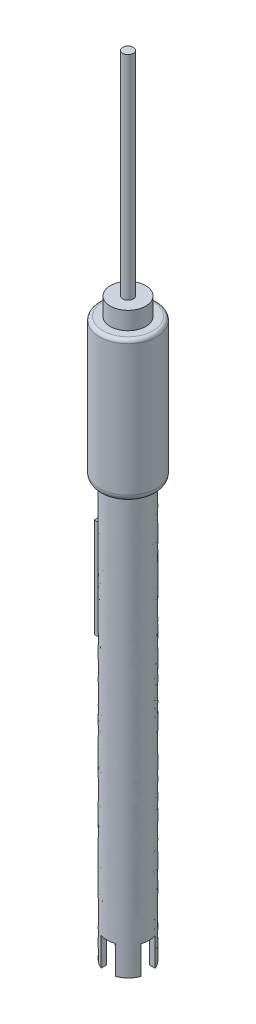
ISO-10303-21;
HEADER;
FILE_DESCRIPTION(('STEP AP214'),'2;1');
FILE_NAME('part.step','',(''),(''),'','','');
FILE_SCHEMA(('AUTOMOTIVE_DESIGN { 1 0 10303 214 1 1 1 1 }'));
ENDSEC;
DATA;
#1=APPLICATION_CONTEXT('core data for automotive mechanical design processes');
#2=APPLICATION_PROTOCOL_DEFINITION('international standard','automotive_design',2000,#1);
#3=PRODUCT_CONTEXT('',#1,'mechanical');
#4=PRODUCT('Part','Part','',(#3));
#5=PRODUCT_RELATED_PRODUCT_CATEGORY('part','',(#4));
#6=PRODUCT_DEFINITION_FORMATION('','',#4);
#7=PRODUCT_DEFINITION_CONTEXT('part definition',#1,'design');
#8=PRODUCT_DEFINITION('design','',#6,#7);
#9=PRODUCT_DEFINITION_SHAPE('','',#8);
#10=(LENGTH_UNIT() NAMED_UNIT(*) SI_UNIT(.MILLI.,.METRE.));
#11=(NAMED_UNIT(*) PLANE_ANGLE_UNIT() SI_UNIT($,.RADIAN.));
#12=(NAMED_UNIT(*) SI_UNIT($,.STERADIAN.) SOLID_ANGLE_UNIT());
#13=UNCERTAINTY_MEASURE_WITH_UNIT(LENGTH_MEASURE(1.E-05),#10,'distance_accuracy_value','');
#14=(GEOMETRIC_REPRESENTATION_CONTEXT(3) GLOBAL_UNCERTAINTY_ASSIGNED_CONTEXT((#13)) GLOBAL_UNIT_ASSIGNED_CONTEXT((#10,
#11,#12)) REPRESENTATION_CONTEXT('',''));
#15=CARTESIAN_POINT('',(0.,0.,0.));
#16=DIRECTION('',(0.,0.,1.));
#17=DIRECTION('',(1.,0.,0.));
#18=AXIS2_PLACEMENT_3D('',#15,#16,#17);
#19=CARTESIAN_POINT('',(0.,117.5,0.));
#20=DIRECTION('',(0.,-1.,0.));
#21=DIRECTION('',(-1.,0.,0.));
#22=AXIS2_PLACEMENT_3D('',#19,#20,#21);
#23=ELLIPSE('',#22,6.,5.9);
#24=DIRECTION('',(0.,-1.,0.));
#25=VECTOR('',#24,1.);
#26=SURFACE_OF_LINEAR_EXTRUSION('',#23,#25);
#27=DIRECTION('',(0.,-1.,0.));
#28=VECTOR('',#27,1.);
#29=CARTESIAN_POINT('',(5.64475488259441,117.5,2.));
#30=LINE('',#29,#28);
#31=CARTESIAN_POINT('',(5.64475488259441,8.,2.));
#32=VERTEX_POINT('',#31);
#33=CARTESIAN_POINT('',(5.64475488259441,0.,2.));
#34=VERTEX_POINT('',#33);
#35=EDGE_CURVE('E264',#32,#34,#30,.T.);
#36=ORIENTED_EDGE('',*,*,#35,.F.);
#37=CARTESIAN_POINT('',(0.,8.00000000000004,0.));
#38=DIRECTION('',(0.,-1.,0.));
#39=DIRECTION('',(-1.,0.,0.));
#40=AXIS2_PLACEMENT_3D('',#37,#38,#39);
#41=ELLIPSE('',#40,6.,5.9);
#42=CARTESIAN_POINT('',(5.64475488259441,8.,-2.));
#43=VERTEX_POINT('',#42);
#44=EDGE_CURVE('E70',#32,#43,#41,.F.);
#45=ORIENTED_EDGE('',*,*,#44,.T.);
#46=DIRECTION('',(0.,-1.,0.));
#47=VECTOR('',#46,1.);
#48=CARTESIAN_POINT('',(5.64475488259441,117.5,-2.));
#49=LINE('',#48,#47);
#50=CARTESIAN_POINT('',(5.64475488259441,0.,-2.));
#51=VERTEX_POINT('',#50);
#52=EDGE_CURVE('E261',#43,#51,#49,.T.);
#53=ORIENTED_EDGE('',*,*,#52,.T.);
#54=CARTESIAN_POINT('',(0.,0.,0.));
#55=DIRECTION('',(0.,-1.,0.));
#56=DIRECTION('',(-1.,0.,0.));
#57=AXIS2_PLACEMENT_3D('',#54,#55,#56);
#58=ELLIPSE('',#57,6.,5.9);
#59=CARTESIAN_POINT('',(2.,0.,-5.56257334533417));
#60=VERTEX_POINT('',#59);
#61=EDGE_CURVE('E412',#60,#51,#58,.T.);
#62=ORIENTED_EDGE('',*,*,#61,.F.);
#63=DIRECTION('',(0.,-1.,0.));
#64=VECTOR('',#63,1.);
#65=CARTESIAN_POINT('',(2.,117.5,-5.56257334533418));
#66=LINE('',#65,#64);
#67=CARTESIAN_POINT('',(2.,8.,-5.56257334533417));
#68=VERTEX_POINT('',#67);
#69=EDGE_CURVE('E222',#60,#68,#66,.F.);
#70=ORIENTED_EDGE('',*,*,#69,.T.);
#71=CARTESIAN_POINT('',(-2.,8.,-5.56257334533417));
#72=VERTEX_POINT('',#71);
#73=EDGE_CURVE('E386',#68,#72,#41,.F.);
#74=ORIENTED_EDGE('',*,*,#73,.T.);
#75=DIRECTION('',(0.,-1.,0.));
#76=VECTOR('',#75,1.);
#77=CARTESIAN_POINT('',(-2.,117.5,-5.56257334533418));
#78=LINE('',#77,#76);
#79=CARTESIAN_POINT('',(-2.,0.,-5.56257334533417));
#80=VERTEX_POINT('',#79);
#81=EDGE_CURVE('E251',#80,#72,#78,.F.);
#82=ORIENTED_EDGE('',*,*,#81,.F.);
#83=CARTESIAN_POINT('',(-5.64475488259441,0.,-2.));
#84=VERTEX_POINT('',#83);
#85=EDGE_CURVE('E297',#84,#80,#58,.T.);
#86=ORIENTED_EDGE('',*,*,#85,.F.);
#87=DIRECTION('',(0.,-1.,0.));
#88=VECTOR('',#87,1.);
#89=CARTESIAN_POINT('',(-5.64475488259441,117.5,-2.));
#90=LINE('',#89,#88);
#91=CARTESIAN_POINT('',(-5.64475488259441,8.,-2.));
#92=VERTEX_POINT('',#91);
#93=EDGE_CURVE('E255',#84,#92,#90,.F.);
#94=ORIENTED_EDGE('',*,*,#93,.T.);
#95=CARTESIAN_POINT('',(-5.64475488259441,8.,2.));
#96=VERTEX_POINT('',#95);
#97=EDGE_CURVE('E389',#92,#96,#41,.F.);
#98=ORIENTED_EDGE('',*,*,#97,.T.);
#99=DIRECTION('',(0.,-1.,0.));
#100=VECTOR('',#99,1.);
#101=CARTESIAN_POINT('',(-5.64475488259441,117.5,2.));
#102=LINE('',#101,#100);
#103=CARTESIAN_POINT('',(-5.64475488259441,0.,2.));
#104=VERTEX_POINT('',#103);
#105=EDGE_CURVE('E258',#104,#96,#102,.F.);
#106=ORIENTED_EDGE('',*,*,#105,.F.);
#107=CARTESIAN_POINT('',(-2.,0.,5.56257334533418));
#108=VERTEX_POINT('',#107);
#109=EDGE_CURVE('E283',#108,#104,#58,.T.);
#110=ORIENTED_EDGE('',*,*,#109,.F.);
#111=DIRECTION('',(0.,-1.,0.));
#112=VECTOR('',#111,1.);
#113=CARTESIAN_POINT('',(-2.,117.5,5.56257334533418));
#114=LINE('',#113,#112);
#115=CARTESIAN_POINT('',(-2.,8.,5.56257334533418));
#116=VERTEX_POINT('',#115);
#117=EDGE_CURVE('E248',#116,#108,#114,.T.);
#118=ORIENTED_EDGE('',*,*,#117,.F.);
#119=CARTESIAN_POINT('',(2.,8.,5.56257334533418));
#120=VERTEX_POINT('',#119);
#121=EDGE_CURVE('E384',#116,#120,#41,.F.);
#122=ORIENTED_EDGE('',*,*,#121,.T.);
#123=DIRECTION('',(0.,-1.,0.));
#124=VECTOR('',#123,1.);
#125=CARTESIAN_POINT('',(2.,117.5,5.56257334533418));
#126=LINE('',#125,#124);
#127=CARTESIAN_POINT('',(2.,0.,5.56257334533418));
#128=VERTEX_POINT('',#127);
#129=EDGE_CURVE('E240',#120,#128,#126,.T.);
#130=ORIENTED_EDGE('',*,*,#129,.T.);
#131=EDGE_CURVE('E410',#34,#128,#58,.T.);
#132=ORIENTED_EDGE('',*,*,#131,.F.);
#133=EDGE_LOOP('',(#36,#45,#53,#62,#70,#74,#82,#86,#94,#98,#106,#110,#118,#122,#130,#132));
#134=FACE_BOUND('',#133,.T.);
#135=DIRECTION('',(0.,-1.,0.));
#136=VECTOR('',#135,1.);
#137=CARTESIAN_POINT('',(-5.16646201866328,117.5,2.99999999999999));
#138=LINE('',#137,#136);
#139=CARTESIAN_POINT('',(-5.16646201866328,78.,2.99999999999999));
#140=VERTEX_POINT('',#139);
#141=CARTESIAN_POINT('',(-5.16646201866328,106.,2.99999999999999));
#142=VERTEX_POINT('',#141);
#143=EDGE_CURVE('E375',#140,#142,#138,.F.);
#144=ORIENTED_EDGE('',*,*,#143,.F.);
#145=CARTESIAN_POINT('',(0.,78.,0.));
#146=DIRECTION('',(0.,-1.,0.));
#147=DIRECTION('',(-1.,0.,0.));
#148=AXIS2_PLACEMENT_3D('',#145,#146,#147);
#149=ELLIPSE('',#148,6.,5.9);
#150=CARTESIAN_POINT('',(-5.16646201866326,78.,-3.00000000000001));
#151=VERTEX_POINT('',#150);
#152=EDGE_CURVE('E366',#151,#140,#149,.F.);
#153=ORIENTED_EDGE('',*,*,#152,.F.);
#154=DIRECTION('',(0.,-1.,0.));
#155=VECTOR('',#154,1.);
#156=CARTESIAN_POINT('',(-5.16646201866326,117.5,-3.00000000000001));
#157=LINE('',#156,#155);
#158=CARTESIAN_POINT('',(-5.16646201866326,106.,-3.00000000000001));
#159=VERTEX_POINT('',#158);
#160=EDGE_CURVE('E369',#159,#151,#157,.T.);
#161=ORIENTED_EDGE('',*,*,#160,.F.);
#162=CARTESIAN_POINT('',(0.,106.,0.));
#163=DIRECTION('',(0.,-1.,0.));
#164=DIRECTION('',(-1.,0.,0.));
#165=AXIS2_PLACEMENT_3D('',#162,#163,#164);
#166=ELLIPSE('',#165,6.,5.9);
#167=EDGE_CURVE('E372',#142,#159,#166,.T.);
#168=ORIENTED_EDGE('',*,*,#167,.F.);
#169=EDGE_LOOP('',(#144,#153,#161,#168));
#170=FACE_BOUND('',#169,.T.);
#171=CARTESIAN_POINT('',(-6.,117.5,0.));
#172=VERTEX_POINT('',#171);
#173=EDGE_CURVE('E292',#172,#172,#23,.T.);
#174=ORIENTED_EDGE('',*,*,#173,.T.);
#175=EDGE_LOOP('',(#174));
#176=FACE_BOUND('',#175,.T.);
#177=ADVANCED_FACE('F62',(#134,#170,#176),#26,.T.);
#178=CARTESIAN_POINT('',(0.,0.,0.));
#179=DIRECTION('',(0.,1.,0.));
#180=DIRECTION('',(0.,0.,1.));
#181=AXIS2_PLACEMENT_3D('',#178,#179,#180);
#182=PLANE('',#181);
#183=DIRECTION('',(1.,0.,0.));
#184=VECTOR('',#183,1.);
#185=CARTESIAN_POINT('',(0.,0.,-2.));
#186=LINE('',#185,#184);
#187=CARTESIAN_POINT('',(4.03112887414927,0.,-2.));
#188=VERTEX_POINT('',#187);
#189=EDGE_CURVE('E216',#188,#51,#186,.T.);
#190=ORIENTED_EDGE('',*,*,#189,.F.);
#191=CARTESIAN_POINT('',(0.,0.,0.));
#192=DIRECTION('',(0.,-1.,0.));
#193=DIRECTION('',(0.,0.,-1.));
#194=AXIS2_PLACEMENT_3D('',#191,#192,#193);
#195=CIRCLE('',#194,4.5);
#196=CARTESIAN_POINT('',(2.,0.,-4.03112887414927));
#197=VERTEX_POINT('',#196);
#198=EDGE_CURVE('E200',#197,#188,#195,.T.);
#199=ORIENTED_EDGE('',*,*,#198,.F.);
#200=DIRECTION('',(0.,0.,1.));
#201=VECTOR('',#200,1.);
#202=CARTESIAN_POINT('',(2.,0.,5.9));
#203=LINE('',#202,#201);
#204=EDGE_CURVE('E214',#197,#60,#203,.F.);
#205=ORIENTED_EDGE('',*,*,#204,.T.);
#206=ORIENTED_EDGE('',*,*,#61,.T.);
#207=EDGE_LOOP('',(#190,#199,#205,#206));
#208=FACE_BOUND('',#207,.T.);
#209=ADVANCED_FACE('F212',(#208),#182,.F.);
#210=DIRECTION('',(0.,0.,1.));
#211=VECTOR('',#210,1.);
#212=CARTESIAN_POINT('',(-2.,0.,5.9));
#213=LINE('',#212,#211);
#214=CARTESIAN_POINT('',(-2.,0.,-4.03112887414927));
#215=VERTEX_POINT('',#214);
#216=EDGE_CURVE('E225',#215,#80,#213,.F.);
#217=ORIENTED_EDGE('',*,*,#216,.F.);
#218=CARTESIAN_POINT('',(-4.03112887414927,0.,-2.));
#219=VERTEX_POINT('',#218);
#220=EDGE_CURVE('E219',#219,#215,#195,.T.);
#221=ORIENTED_EDGE('',*,*,#220,.F.);
#222=DIRECTION('',(1.,0.,0.));
#223=VECTOR('',#222,1.);
#224=CARTESIAN_POINT('',(6.,0.,-2.));
#225=LINE('',#224,#223);
#226=EDGE_CURVE('E243',#219,#84,#225,.F.);
#227=ORIENTED_EDGE('',*,*,#226,.T.);
#228=ORIENTED_EDGE('',*,*,#85,.T.);
#229=EDGE_LOOP('',(#217,#221,#227,#228));
#230=FACE_BOUND('',#229,.T.);
#231=ADVANCED_FACE('F460',(#230),#182,.F.);
#232=DIRECTION('',(1.,0.,0.));
#233=VECTOR('',#232,1.);
#234=CARTESIAN_POINT('',(6.,0.,2.));
#235=LINE('',#234,#233);
#236=CARTESIAN_POINT('',(-4.03112887414927,0.,2.));
#237=VERTEX_POINT('',#236);
#238=EDGE_CURVE('E241',#237,#104,#235,.F.);
#239=ORIENTED_EDGE('',*,*,#238,.F.);
#240=CARTESIAN_POINT('',(-2.,0.,4.03112887414927));
#241=VERTEX_POINT('',#240);
#242=EDGE_CURVE('E408',#241,#237,#195,.T.);
#243=ORIENTED_EDGE('',*,*,#242,.F.);
#244=DIRECTION('',(0.,0.,1.));
#245=VECTOR('',#244,1.);
#246=CARTESIAN_POINT('',(-2.,0.,0.));
#247=LINE('',#246,#245);
#248=EDGE_CURVE('E382',#241,#108,#247,.T.);
#249=ORIENTED_EDGE('',*,*,#248,.T.);
#250=ORIENTED_EDGE('',*,*,#109,.T.);
#251=EDGE_LOOP('',(#239,#243,#249,#250));
#252=FACE_BOUND('',#251,.T.);
#253=ADVANCED_FACE('F335',(#252),#182,.F.);
#254=CARTESIAN_POINT('',(0.,0.,0.));
#255=DIRECTION('',(0.,1.,0.));
#256=DIRECTION('',(0.,0.,1.));
#257=AXIS2_PLACEMENT_3D('',#254,#255,#256);
#258=CYLINDRICAL_SURFACE('',#257,8.07499999999998);
#259=CARTESIAN_POINT('',(0.,156.5,0.));
#260=DIRECTION('',(0.,-1.,0.));
#261=DIRECTION('',(0.,0.,-1.));
#262=AXIS2_PLACEMENT_3D('',#259,#260,#261);
#263=CIRCLE('',#262,8.07499999999998);
#264=CARTESIAN_POINT('',(0.,156.5,-8.07499999999998));
#265=VERTEX_POINT('',#264);
#266=EDGE_CURVE('E362',#265,#265,#263,.T.);
#267=ORIENTED_EDGE('',*,*,#266,.T.);
#268=EDGE_LOOP('',(#267));
#269=FACE_BOUND('',#268,.T.);
#270=CARTESIAN_POINT('',(0.,119.49232903909,0.));
#271=DIRECTION('',(0.,-1.,0.));
#272=DIRECTION('',(0.,0.,-1.));
#273=AXIS2_PLACEMENT_3D('',#270,#271,#272);
#274=CIRCLE('',#273,8.07499999999998);
#275=CARTESIAN_POINT('',(0.,119.49232903909,-8.07499999999998));
#276=VERTEX_POINT('',#275);
#277=EDGE_CURVE('E348',#276,#276,#274,.F.);
#278=ORIENTED_EDGE('',*,*,#277,.T.);
#279=EDGE_LOOP('',(#278));
#280=FACE_BOUND('',#279,.T.);
#281=ADVANCED_FACE('F331',(#269,#280),#258,.T.);
#282=CARTESIAN_POINT('',(8.07499999999998,157.5,0.));
#283=DIRECTION('',(0.,-1.,0.));
#284=DIRECTION('',(0.,0.,-1.));
#285=AXIS2_PLACEMENT_3D('',#282,#283,#284);
#286=PLANE('',#285);
#287=CARTESIAN_POINT('',(0.,157.5,0.));
#288=DIRECTION('',(0.,-1.,0.));
#289=DIRECTION('',(0.,0.,-1.));
#290=AXIS2_PLACEMENT_3D('',#287,#288,#289);
#291=CIRCLE('',#290,7.07499999999998);
#292=CARTESIAN_POINT('',(0.,157.5,-7.07499999999998));
#293=VERTEX_POINT('',#292);
#294=EDGE_CURVE('E354',#293,#293,#291,.F.);
#295=ORIENTED_EDGE('',*,*,#294,.T.);
#296=EDGE_LOOP('',(#295));
#297=FACE_BOUND('',#296,.T.);
#298=CARTESIAN_POINT('',(0.,157.5,0.));
#299=DIRECTION('',(0.,1.,0.));
#300=DIRECTION('',(0.,0.,1.));
#301=AXIS2_PLACEMENT_3D('',#298,#299,#300);
#302=CIRCLE('',#301,5.);
#303=CARTESIAN_POINT('',(0.,157.5,5.));
#304=VERTEX_POINT('',#303);
#305=EDGE_CURVE('E350',#304,#304,#302,.T.);
#306=ORIENTED_EDGE('',*,*,#305,.F.);
#307=EDGE_LOOP('',(#306));
#308=FACE_BOUND('',#307,.T.);
#309=ADVANCED_FACE('F328',(#297,#308),#286,.F.);
#310=CARTESIAN_POINT('',(0.,119.49232903909,0.));
#311=DIRECTION('',(0.,-1.,0.));
#312=DIRECTION('',(0.,0.,-1.));
#313=AXIS2_PLACEMENT_3D('',#310,#311,#312);
#314=TOROIDAL_SURFACE('',#313,6.07499999999998,2.);
#315=CARTESIAN_POINT('',(0.,117.5,0.));
#316=DIRECTION('',(0.,1.,0.));
#317=DIRECTION('',(0.,0.,1.));
#318=AXIS2_PLACEMENT_3D('',#315,#316,#317);
#319=CIRCLE('',#318,6.24999999999999);
#320=CARTESIAN_POINT('',(0.,117.5,6.24999999999999));
#321=VERTEX_POINT('',#320);
#322=EDGE_CURVE('E296',#321,#321,#319,.F.);
#323=ORIENTED_EDGE('',*,*,#322,.F.);
#324=EDGE_LOOP('',(#323));
#325=FACE_BOUND('',#324,.T.);
#326=ORIENTED_EDGE('',*,*,#277,.F.);
#327=EDGE_LOOP('',(#326));
#328=FACE_BOUND('',#327,.T.);
#329=ADVANCED_FACE('F326',(#325,#328),#314,.T.);
#330=CARTESIAN_POINT('',(0.,162.5,0.));
#331=DIRECTION('',(0.,-1.,0.));
#332=DIRECTION('',(0.,0.,-1.));
#333=AXIS2_PLACEMENT_3D('',#330,#331,#332);
#334=CYLINDRICAL_SURFACE('',#333,5.);
#335=CARTESIAN_POINT('',(0.,162.5,0.));
#336=DIRECTION('',(0.,1.,0.));
#337=DIRECTION('',(0.,0.,1.));
#338=AXIS2_PLACEMENT_3D('',#335,#336,#337);
#339=CIRCLE('',#338,5.);
#340=CARTESIAN_POINT('',(0.,162.5,5.));
#341=VERTEX_POINT('',#340);
#342=EDGE_CURVE('E351',#341,#341,#339,.T.);
#343=ORIENTED_EDGE('',*,*,#342,.F.);
#344=EDGE_LOOP('',(#343));
#345=FACE_BOUND('',#344,.T.);
#346=ORIENTED_EDGE('',*,*,#305,.T.);
#347=EDGE_LOOP('',(#346));
#348=FACE_BOUND('',#347,.T.);
#349=ADVANCED_FACE('F322',(#345,#348),#334,.T.);
#350=CARTESIAN_POINT('',(0.,162.5,0.));
#351=DIRECTION('',(0.,1.,0.));
#352=DIRECTION('',(0.,0.,1.));
#353=AXIS2_PLACEMENT_3D('',#350,#351,#352);
#354=PLANE('',#353);
#355=CARTESIAN_POINT('',(0.,162.5,0.));
#356=DIRECTION('',(0.,1.,0.));
#357=DIRECTION('',(0.,0.,1.));
#358=AXIS2_PLACEMENT_3D('',#355,#356,#357);
#359=CIRCLE('',#358,1.5);
#360=CARTESIAN_POINT('',(0.,162.5,-1.5));
#361=VERTEX_POINT('',#360);
#362=EDGE_CURVE('E365',#361,#361,#359,.T.);
#363=ORIENTED_EDGE('',*,*,#362,.F.);
#364=EDGE_LOOP('',(#363));
#365=FACE_BOUND('',#364,.T.);
#366=ORIENTED_EDGE('',*,*,#342,.T.);
#367=EDGE_LOOP('',(#366));
#368=FACE_BOUND('',#367,.T.);
#369=ADVANCED_FACE('F319',(#365,#368),#354,.T.);
#370=CARTESIAN_POINT('',(0.,156.5,0.));
#371=DIRECTION('',(0.,-1.,0.));
#372=DIRECTION('',(0.,0.,-1.));
#373=AXIS2_PLACEMENT_3D('',#370,#371,#372);
#374=TOROIDAL_SURFACE('',#373,7.07499999999998,1.);
#375=ORIENTED_EDGE('',*,*,#266,.F.);
#376=EDGE_LOOP('',(#375));
#377=FACE_BOUND('',#376,.T.);
#378=ORIENTED_EDGE('',*,*,#294,.F.);
#379=EDGE_LOOP('',(#378));
#380=FACE_BOUND('',#379,.T.);
#381=ADVANCED_FACE('F64',(#377,#380),#374,.T.);
#382=CARTESIAN_POINT('',(0.,222.5,0.));
#383=DIRECTION('',(0.,-1.,0.));
#384=DIRECTION('',(0.,0.,-1.));
#385=AXIS2_PLACEMENT_3D('',#382,#383,#384);
#386=CYLINDRICAL_SURFACE('',#385,1.5);
#387=CARTESIAN_POINT('',(0.,222.5,0.));
#388=DIRECTION('',(0.,1.,0.));
#389=DIRECTION('',(0.,0.,1.));
#390=AXIS2_PLACEMENT_3D('',#387,#388,#389);
#391=CIRCLE('',#390,1.5);
#392=CARTESIAN_POINT('',(0.,222.5,-1.5));
#393=VERTEX_POINT('',#392);
#394=EDGE_CURVE('E357',#393,#393,#391,.T.);
#395=CARTESIAN_POINT('',(0.,222.5,-1.5));
#396=CARTESIAN_POINT('',(0.,221.875,-1.5));
#397=CARTESIAN_POINT('',(0.,221.25,-1.5));
#398=CARTESIAN_POINT('',(0.,220.,-1.5));
#399=CARTESIAN_POINT('',(0.,219.375,-1.5));
#400=CARTESIAN_POINT('',(0.,218.125,-1.5));
#401=CARTESIAN_POINT('',(0.,217.5,-1.5));
#402=CARTESIAN_POINT('',(0.,216.25,-1.5));
#403=CARTESIAN_POINT('',(0.,215.625,-1.5));
#404=CARTESIAN_POINT('',(0.,214.375,-1.5));
#405=CARTESIAN_POINT('',(0.,213.75,-1.5));
#406=CARTESIAN_POINT('',(0.,212.5,-1.5));
#407=CARTESIAN_POINT('',(0.,211.875,-1.5));
#408=CARTESIAN_POINT('',(0.,210.625,-1.5));
#409=CARTESIAN_POINT('',(0.,210.,-1.5));
#410=CARTESIAN_POINT('',(0.,208.75,-1.5));
#411=CARTESIAN_POINT('',(0.,208.125,-1.5));
#412=CARTESIAN_POINT('',(0.,206.875,-1.5));
#413=CARTESIAN_POINT('',(0.,206.25,-1.5));
#414=CARTESIAN_POINT('',(0.,205.,-1.5));
#415=CARTESIAN_POINT('',(0.,204.375,-1.5));
#416=CARTESIAN_POINT('',(0.,203.125,-1.5));
#417=CARTESIAN_POINT('',(0.,202.5,-1.5));
#418=CARTESIAN_POINT('',(0.,201.25,-1.5));
#419=CARTESIAN_POINT('',(0.,200.625,-1.5));
#420=CARTESIAN_POINT('',(0.,199.375,-1.5));
#421=CARTESIAN_POINT('',(0.,198.75,-1.5));
#422=CARTESIAN_POINT('',(0.,197.5,-1.5));
#423=CARTESIAN_POINT('',(0.,196.875,-1.5));
#424=CARTESIAN_POINT('',(0.,195.625,-1.5));
#425=CARTESIAN_POINT('',(0.,195.,-1.5));
#426=CARTESIAN_POINT('',(0.,193.75,-1.5));
#427=CARTESIAN_POINT('',(0.,193.125,-1.5));
#428=CARTESIAN_POINT('',(0.,191.875,-1.5));
#429=CARTESIAN_POINT('',(0.,191.25,-1.5));
#430=CARTESIAN_POINT('',(0.,190.,-1.5));
#431=CARTESIAN_POINT('',(0.,189.375,-1.5));
#432=CARTESIAN_POINT('',(0.,188.125,-1.5));
#433=CARTESIAN_POINT('',(0.,187.5,-1.5));
#434=CARTESIAN_POINT('',(0.,186.25,-1.5));
#435=CARTESIAN_POINT('',(0.,185.625,-1.5));
#436=CARTESIAN_POINT('',(0.,184.375,-1.5));
#437=CARTESIAN_POINT('',(0.,183.75,-1.5));
#438=CARTESIAN_POINT('',(0.,182.5,-1.5));
#439=CARTESIAN_POINT('',(0.,181.875,-1.5));
#440=CARTESIAN_POINT('',(0.,180.625,-1.5));
#441=CARTESIAN_POINT('',(0.,180.,-1.5));
#442=CARTESIAN_POINT('',(0.,178.75,-1.5));
#443=CARTESIAN_POINT('',(0.,178.125,-1.5));
#444=CARTESIAN_POINT('',(0.,176.875,-1.5));
#445=CARTESIAN_POINT('',(0.,176.25,-1.5));
#446=CARTESIAN_POINT('',(0.,175.,-1.5));
#447=CARTESIAN_POINT('',(0.,174.375,-1.5));
#448=CARTESIAN_POINT('',(0.,173.125,-1.5));
#449=CARTESIAN_POINT('',(0.,172.5,-1.5));
#450=CARTESIAN_POINT('',(0.,171.25,-1.5));
#451=CARTESIAN_POINT('',(0.,170.625,-1.5));
#452=CARTESIAN_POINT('',(0.,169.375,-1.5));
#453=CARTESIAN_POINT('',(0.,168.75,-1.5));
#454=CARTESIAN_POINT('',(0.,167.5,-1.5));
#455=CARTESIAN_POINT('',(0.,166.875,-1.5));
#456=CARTESIAN_POINT('',(0.,165.625,-1.5));
#457=CARTESIAN_POINT('',(0.,165.,-1.5));
#458=CARTESIAN_POINT('',(0.,163.75,-1.5));
#459=CARTESIAN_POINT('',(0.,163.125,-1.5));
#460=CARTESIAN_POINT('',(0.,162.5,-1.5));
#461=B_SPLINE_CURVE_WITH_KNOTS('',3,(#395,#396,#397,#398,#399,#400,#401,#402,#403,#404,#405,
#406,#407,#408,#409,#410,#411,#412,#413,#414,#415,#416,#417,#418,#419,#420,#421,#422,#423,#424,
#425,#426,#427,#428,#429,#430,#431,#432,#433,#434,#435,#436,#437,#438,#439,#440,#441,#442,#443,
#444,#445,#446,#447,#448,#449,#450,#451,#452,#453,#454,#455,#456,#457,#458,#459,#460),
.UNSPECIFIED.,.F.,.F.,(4,2,2,2,2,2,2,2,2,2,2,2,2,2,2,2,2,2,2,2,2,2,2,2,2,2,2,2,2,2,2,2,4),(0.,
1.87499999999999,3.74999999999998,5.62499999999999,7.49999999999998,9.37499999999999,11.25,
13.125,15.,16.875,18.75,20.625,22.5,24.375,26.25,28.125,30.,31.875,33.75,35.625,37.5,39.375,
41.25,43.125,45.,46.875,48.75,50.625,52.5,54.375,56.25,58.125,60.),.UNSPECIFIED.);
#462=EDGE_CURVE('BSEAM314',#393,#361,#461,.T.);
#463=ORIENTED_EDGE('',*,*,#394,.F.);
#464=ORIENTED_EDGE('',*,*,#362,.T.);
#465=ORIENTED_EDGE('',*,*,#462,.T.);
#466=ORIENTED_EDGE('',*,*,#462,.F.);
#467=EDGE_LOOP('',(#463,#465,#464,#466));
#468=FACE_BOUND('',#467,.T.);
#469=ADVANCED_FACE('F314',(#468),#386,.T.);
#470=CARTESIAN_POINT('',(0.,222.5,0.));
#471=DIRECTION('',(0.,1.,0.));
#472=DIRECTION('',(0.,0.,1.));
#473=AXIS2_PLACEMENT_3D('',#470,#471,#472);
#474=PLANE('',#473);
#475=ORIENTED_EDGE('',*,*,#394,.T.);
#476=EDGE_LOOP('',(#475));
#477=FACE_BOUND('',#476,.T.);
#478=ADVANCED_FACE('F310',(#477),#474,.T.);
#479=CARTESIAN_POINT('',(0.,117.5,0.));
#480=DIRECTION('',(0.,1.,0.));
#481=DIRECTION('',(0.,0.,1.));
#482=AXIS2_PLACEMENT_3D('',#479,#480,#481);
#483=PLANE('',#482);
#484=ORIENTED_EDGE('',*,*,#322,.T.);
#485=EDGE_LOOP('',(#484));
#486=FACE_BOUND('',#485,.T.);
#487=ORIENTED_EDGE('',*,*,#173,.F.);
#488=EDGE_LOOP('',(#487));
#489=FACE_BOUND('',#488,.T.);
#490=ADVANCED_FACE('F306',(#486,#489),#483,.F.);
#491=DIRECTION('',(0.,0.,1.));
#492=VECTOR('',#491,1.);
#493=CARTESIAN_POINT('',(2.,0.,0.));
#494=LINE('',#493,#492);
#495=CARTESIAN_POINT('',(2.,0.,4.03112887414927));
#496=VERTEX_POINT('',#495);
#497=EDGE_CURVE('E378',#496,#128,#494,.T.);
#498=ORIENTED_EDGE('',*,*,#497,.F.);
#499=CARTESIAN_POINT('',(4.03112887414927,0.,2.));
#500=VERTEX_POINT('',#499);
#501=EDGE_CURVE('E217',#500,#496,#195,.T.);
#502=ORIENTED_EDGE('',*,*,#501,.F.);
#503=DIRECTION('',(1.,0.,0.));
#504=VECTOR('',#503,1.);
#505=CARTESIAN_POINT('',(0.,0.,2.));
#506=LINE('',#505,#504);
#507=EDGE_CURVE('E380',#500,#34,#506,.T.);
#508=ORIENTED_EDGE('',*,*,#507,.T.);
#509=ORIENTED_EDGE('',*,*,#131,.T.);
#510=EDGE_LOOP('',(#498,#502,#508,#509));
#511=FACE_BOUND('',#510,.T.);
#512=ADVANCED_FACE('F309',(#511),#182,.F.);
#513=CARTESIAN_POINT('',(-6.5,106.,2.99999999999999));
#514=DIRECTION('',(0.,0.,1.));
#515=DIRECTION('',(0.,-1.,0.));
#516=AXIS2_PLACEMENT_3D('',#513,#514,#515);
#517=PLANE('',#516);
#518=DIRECTION('',(1.,0.,0.));
#519=VECTOR('',#518,1.);
#520=CARTESIAN_POINT('',(-6.5,78.,2.99999999999999));
#521=LINE('',#520,#519);
#522=CARTESIAN_POINT('',(-6.5,78.,2.99999999999999));
#523=VERTEX_POINT('',#522);
#524=EDGE_CURVE('E279',#523,#140,#521,.T.);
#525=ORIENTED_EDGE('',*,*,#524,.T.);
#526=ORIENTED_EDGE('',*,*,#143,.T.);
#527=DIRECTION('',(1.,0.,0.));
#528=VECTOR('',#527,1.);
#529=CARTESIAN_POINT('',(-6.5,106.,2.99999999999999));
#530=LINE('',#529,#528);
#531=CARTESIAN_POINT('',(-6.5,106.,2.99999999999999));
#532=VERTEX_POINT('',#531);
#533=EDGE_CURVE('E280',#532,#142,#530,.T.);
#534=ORIENTED_EDGE('',*,*,#533,.F.);
#535=DIRECTION('',(0.,-1.,0.));
#536=VECTOR('',#535,1.);
#537=CARTESIAN_POINT('',(-6.5,106.,2.99999999999999));
#538=LINE('',#537,#536);
#539=EDGE_CURVE('E267',#532,#523,#538,.T.);
#540=ORIENTED_EDGE('',*,*,#539,.T.);
#541=EDGE_LOOP('',(#525,#526,#534,#540));
#542=FACE_BOUND('',#541,.T.);
#543=ADVANCED_FACE('F304',(#542),#517,.T.);
#544=CARTESIAN_POINT('',(-6.5,106.,-3.00000000000001));
#545=DIRECTION('',(0.,1.,0.));
#546=DIRECTION('',(0.,0.,1.));
#547=AXIS2_PLACEMENT_3D('',#544,#545,#546);
#548=PLANE('',#547);
#549=ORIENTED_EDGE('',*,*,#533,.T.);
#550=ORIENTED_EDGE('',*,*,#167,.T.);
#551=DIRECTION('',(1.,0.,0.));
#552=VECTOR('',#551,1.);
#553=CARTESIAN_POINT('',(-6.5,106.,-3.00000000000001));
#554=LINE('',#553,#552);
#555=CARTESIAN_POINT('',(-6.5,106.,-3.00000000000001));
#556=VERTEX_POINT('',#555);
#557=EDGE_CURVE('E284',#556,#159,#554,.T.);
#558=ORIENTED_EDGE('',*,*,#557,.F.);
#559=DIRECTION('',(0.,0.,1.));
#560=VECTOR('',#559,1.);
#561=CARTESIAN_POINT('',(-6.5,106.,-3.00000000000001));
#562=LINE('',#561,#560);
#563=EDGE_CURVE('E276',#556,#532,#562,.T.);
#564=ORIENTED_EDGE('',*,*,#563,.T.);
#565=EDGE_LOOP('',(#549,#550,#558,#564));
#566=FACE_BOUND('',#565,.T.);
#567=ADVANCED_FACE('F490',(#566),#548,.T.);
#568=CARTESIAN_POINT('',(-6.5,106.,-3.00000000000001));
#569=DIRECTION('',(0.,0.,-1.));
#570=DIRECTION('',(0.,1.,0.));
#571=AXIS2_PLACEMENT_3D('',#568,#569,#570);
#572=PLANE('',#571);
#573=ORIENTED_EDGE('',*,*,#557,.T.);
#574=ORIENTED_EDGE('',*,*,#160,.T.);
#575=DIRECTION('',(1.,0.,0.));
#576=VECTOR('',#575,1.);
#577=CARTESIAN_POINT('',(-6.5,78.,-3.00000000000001));
#578=LINE('',#577,#576);
#579=CARTESIAN_POINT('',(-6.5,78.,-3.00000000000001));
#580=VERTEX_POINT('',#579);
#581=EDGE_CURVE('E287',#580,#151,#578,.T.);
#582=ORIENTED_EDGE('',*,*,#581,.F.);
#583=DIRECTION('',(0.,1.,0.));
#584=VECTOR('',#583,1.);
#585=CARTESIAN_POINT('',(-6.5,106.,-3.00000000000001));
#586=LINE('',#585,#584);
#587=EDGE_CURVE('E273',#580,#556,#586,.T.);
#588=ORIENTED_EDGE('',*,*,#587,.T.);
#589=EDGE_LOOP('',(#573,#574,#582,#588));
#590=FACE_BOUND('',#589,.T.);
#591=ADVANCED_FACE('F493',(#590),#572,.T.);
#592=CARTESIAN_POINT('',(-6.5,78.,-3.00000000000001));
#593=DIRECTION('',(0.,-1.,0.));
#594=DIRECTION('',(0.,0.,-1.));
#595=AXIS2_PLACEMENT_3D('',#592,#593,#594);
#596=PLANE('',#595);
#597=ORIENTED_EDGE('',*,*,#581,.T.);
#598=ORIENTED_EDGE('',*,*,#152,.T.);
#599=ORIENTED_EDGE('',*,*,#524,.F.);
#600=DIRECTION('',(0.,0.,-1.));
#601=VECTOR('',#600,1.);
#602=CARTESIAN_POINT('',(-6.5,78.,-3.00000000000001));
#603=LINE('',#602,#601);
#604=EDGE_CURVE('E270',#523,#580,#603,.T.);
#605=ORIENTED_EDGE('',*,*,#604,.T.);
#606=EDGE_LOOP('',(#597,#598,#599,#605));
#607=FACE_BOUND('',#606,.T.);
#608=ADVANCED_FACE('F488',(#607),#596,.T.);
#609=CARTESIAN_POINT('',(-6.5,0.,0.));
#610=DIRECTION('',(-1.,0.,0.));
#611=DIRECTION('',(0.,0.,1.));
#612=AXIS2_PLACEMENT_3D('',#609,#610,#611);
#613=PLANE('',#612);
#614=ORIENTED_EDGE('',*,*,#539,.F.);
#615=ORIENTED_EDGE('',*,*,#563,.F.);
#616=ORIENTED_EDGE('',*,*,#587,.F.);
#617=ORIENTED_EDGE('',*,*,#604,.F.);
#618=EDGE_LOOP('',(#614,#615,#616,#617));
#619=FACE_BOUND('',#618,.T.);
#620=ADVANCED_FACE('F485',(#619),#613,.T.);
#621=CARTESIAN_POINT('',(6.,8.,2.));
#622=DIRECTION('',(0.,0.,1.));
#623=DIRECTION('',(1.,0.,0.));
#624=AXIS2_PLACEMENT_3D('',#621,#622,#623);
#625=PLANE('',#624);
#626=ORIENTED_EDGE('',*,*,#507,.F.);
#627=DIRECTION('',(0.,-1.,0.));
#628=VECTOR('',#627,1.);
#629=CARTESIAN_POINT('',(4.03112887414927,8.00000000000004,2.));
#630=LINE('',#629,#628);
#631=CARTESIAN_POINT('',(4.03112887414927,8.00000000000004,2.));
#632=VERTEX_POINT('',#631);
#633=EDGE_CURVE('E229',#500,#632,#630,.F.);
#634=ORIENTED_EDGE('',*,*,#633,.T.);
#635=DIRECTION('',(1.,0.,0.));
#636=VECTOR('',#635,1.);
#637=CARTESIAN_POINT('',(6.,8.,2.));
#638=LINE('',#637,#636);
#639=EDGE_CURVE('E233',#32,#632,#638,.F.);
#640=ORIENTED_EDGE('',*,*,#639,.F.);
#641=ORIENTED_EDGE('',*,*,#35,.T.);
#642=EDGE_LOOP('',(#626,#634,#640,#641));
#643=FACE_BOUND('',#642,.T.);
#644=ADVANCED_FACE('F447',(#643),#625,.F.);
#645=CARTESIAN_POINT('',(6.,8.,-2.));
#646=DIRECTION('',(0.,0.,1.));
#647=DIRECTION('',(1.,0.,0.));
#648=AXIS2_PLACEMENT_3D('',#645,#646,#647);
#649=PLANE('',#648);
#650=DIRECTION('',(0.,-1.,0.));
#651=VECTOR('',#650,1.);
#652=CARTESIAN_POINT('',(4.03112887414927,8.00000000000004,-2.));
#653=LINE('',#652,#651);
#654=CARTESIAN_POINT('',(4.03112887414927,8.00000000000004,-2.));
#655=VERTEX_POINT('',#654);
#656=EDGE_CURVE('E449',#188,#655,#653,.F.);
#657=ORIENTED_EDGE('',*,*,#656,.F.);
#658=ORIENTED_EDGE('',*,*,#189,.T.);
#659=ORIENTED_EDGE('',*,*,#52,.F.);
#660=DIRECTION('',(1.,0.,0.));
#661=VECTOR('',#660,1.);
#662=CARTESIAN_POINT('',(6.,8.,-2.));
#663=LINE('',#662,#661);
#664=EDGE_CURVE('E237',#43,#655,#663,.F.);
#665=ORIENTED_EDGE('',*,*,#664,.T.);
#666=EDGE_LOOP('',(#657,#658,#659,#665));
#667=FACE_BOUND('',#666,.T.);
#668=ADVANCED_FACE('F418',(#667),#649,.T.);
#669=CARTESIAN_POINT('',(-4.03112887414927,8.00000000000004,2.));
#670=VERTEX_POINT('',#669);
#671=EDGE_CURVE('E236',#670,#96,#638,.F.);
#672=ORIENTED_EDGE('',*,*,#671,.F.);
#673=DIRECTION('',(0.,-1.,0.));
#674=VECTOR('',#673,1.);
#675=CARTESIAN_POINT('',(-4.03112887414927,8.00000000000004,2.));
#676=LINE('',#675,#674);
#677=EDGE_CURVE('E405',#670,#237,#676,.T.);
#678=ORIENTED_EDGE('',*,*,#677,.T.);
#679=ORIENTED_EDGE('',*,*,#238,.T.);
#680=ORIENTED_EDGE('',*,*,#105,.T.);
#681=EDGE_LOOP('',(#672,#678,#679,#680));
#682=FACE_BOUND('',#681,.T.);
#683=ADVANCED_FACE('F402',(#682),#625,.F.);
#684=DIRECTION('',(0.,-1.,0.));
#685=VECTOR('',#684,1.);
#686=CARTESIAN_POINT('',(-4.03112887414927,8.00000000000004,-2.));
#687=LINE('',#686,#685);
#688=CARTESIAN_POINT('',(-4.03112887414927,8.00000000000004,-2.));
#689=VERTEX_POINT('',#688);
#690=EDGE_CURVE('E207',#689,#219,#687,.T.);
#691=ORIENTED_EDGE('',*,*,#690,.F.);
#692=EDGE_CURVE('E235',#689,#92,#663,.F.);
#693=ORIENTED_EDGE('',*,*,#692,.T.);
#694=ORIENTED_EDGE('',*,*,#93,.F.);
#695=ORIENTED_EDGE('',*,*,#226,.F.);
#696=EDGE_LOOP('',(#691,#693,#694,#695));
#697=FACE_BOUND('',#696,.T.);
#698=ADVANCED_FACE('F464',(#697),#649,.T.);
#699=CARTESIAN_POINT('',(0.,8.,0.));
#700=DIRECTION('',(0.,-1.,0.));
#701=DIRECTION('',(1.,0.,0.));
#702=AXIS2_PLACEMENT_3D('',#699,#700,#701);
#703=PLANE('',#702);
#704=ORIENTED_EDGE('',*,*,#639,.T.);
#705=CARTESIAN_POINT('',(0.,8.00000000000004,0.));
#706=DIRECTION('',(0.,-1.,0.));
#707=DIRECTION('',(0.,0.,-1.));
#708=AXIS2_PLACEMENT_3D('',#705,#706,#707);
#709=CIRCLE('',#708,4.5);
#710=CARTESIAN_POINT('',(2.,8.,4.03112887414927));
#711=VERTEX_POINT('',#710);
#712=EDGE_CURVE('E84',#632,#711,#709,.T.);
#713=ORIENTED_EDGE('',*,*,#712,.T.);
#714=DIRECTION('',(0.,0.,1.));
#715=VECTOR('',#714,1.);
#716=CARTESIAN_POINT('',(2.,8.,5.9));
#717=LINE('',#716,#715);
#718=EDGE_CURVE('E244',#120,#711,#717,.F.);
#719=ORIENTED_EDGE('',*,*,#718,.F.);
#720=ORIENTED_EDGE('',*,*,#121,.F.);
#721=DIRECTION('',(0.,0.,1.));
#722=VECTOR('',#721,1.);
#723=CARTESIAN_POINT('',(-2.,8.,5.9));
#724=LINE('',#723,#722);
#725=CARTESIAN_POINT('',(-2.,8.00000000000004,4.03112887414927));
#726=VERTEX_POINT('',#725);
#727=EDGE_CURVE('E227',#116,#726,#724,.F.);
#728=ORIENTED_EDGE('',*,*,#727,.T.);
#729=EDGE_CURVE('E427',#726,#670,#709,.T.);
#730=ORIENTED_EDGE('',*,*,#729,.T.);
#731=ORIENTED_EDGE('',*,*,#671,.T.);
#732=ORIENTED_EDGE('',*,*,#97,.F.);
#733=ORIENTED_EDGE('',*,*,#692,.F.);
#734=CARTESIAN_POINT('',(-2.,8.,-4.03112887414927));
#735=VERTEX_POINT('',#734);
#736=EDGE_CURVE('E77',#689,#735,#709,.T.);
#737=ORIENTED_EDGE('',*,*,#736,.T.);
#738=EDGE_CURVE('E224',#735,#72,#724,.F.);
#739=ORIENTED_EDGE('',*,*,#738,.T.);
#740=ORIENTED_EDGE('',*,*,#73,.F.);
#741=CARTESIAN_POINT('',(2.,8.00000000000004,-4.03112887414927));
#742=VERTEX_POINT('',#741);
#743=EDGE_CURVE('E422',#742,#68,#717,.F.);
#744=ORIENTED_EDGE('',*,*,#743,.F.);
#745=EDGE_CURVE('E203',#742,#655,#709,.T.);
#746=ORIENTED_EDGE('',*,*,#745,.T.);
#747=ORIENTED_EDGE('',*,*,#664,.F.);
#748=ORIENTED_EDGE('',*,*,#44,.F.);
#749=EDGE_LOOP('',(#704,#713,#719,#720,#728,#730,#731,#732,#733,#737,#739,#740,#744,#746,#747,#748));
#750=FACE_BOUND('',#749,.T.);
#751=ADVANCED_FACE('F419',(#750),#703,.T.);
#752=CARTESIAN_POINT('',(2.,8.,5.9));
#753=DIRECTION('',(-1.,0.,0.));
#754=DIRECTION('',(0.,0.,1.));
#755=AXIS2_PLACEMENT_3D('',#752,#753,#754);
#756=PLANE('',#755);
#757=DIRECTION('',(0.,-1.,0.));
#758=VECTOR('',#757,1.);
#759=CARTESIAN_POINT('',(2.,8.00000000000004,-4.03112887414927));
#760=LINE('',#759,#758);
#761=EDGE_CURVE('E197',#742,#197,#760,.T.);
#762=ORIENTED_EDGE('',*,*,#761,.F.);
#763=ORIENTED_EDGE('',*,*,#743,.T.);
#764=ORIENTED_EDGE('',*,*,#69,.F.);
#765=ORIENTED_EDGE('',*,*,#204,.F.);
#766=EDGE_LOOP('',(#762,#763,#764,#765));
#767=FACE_BOUND('',#766,.T.);
#768=ADVANCED_FACE('F220',(#767),#756,.T.);
#769=CARTESIAN_POINT('',(-2.,8.,5.9));
#770=DIRECTION('',(-1.,0.,0.));
#771=DIRECTION('',(0.,0.,1.));
#772=AXIS2_PLACEMENT_3D('',#769,#770,#771);
#773=PLANE('',#772);
#774=ORIENTED_EDGE('',*,*,#738,.F.);
#775=DIRECTION('',(0.,-1.,0.));
#776=VECTOR('',#775,1.);
#777=CARTESIAN_POINT('',(-2.,8.00000000000004,-4.03112887414927));
#778=LINE('',#777,#776);
#779=EDGE_CURVE('E208',#735,#215,#778,.T.);
#780=ORIENTED_EDGE('',*,*,#779,.T.);
#781=ORIENTED_EDGE('',*,*,#216,.T.);
#782=ORIENTED_EDGE('',*,*,#81,.T.);
#783=EDGE_LOOP('',(#774,#780,#781,#782));
#784=FACE_BOUND('',#783,.T.);
#785=ADVANCED_FACE('F456',(#784),#773,.F.);
#786=ORIENTED_EDGE('',*,*,#248,.F.);
#787=DIRECTION('',(0.,-1.,0.));
#788=VECTOR('',#787,1.);
#789=CARTESIAN_POINT('',(-2.,8.00000000000004,4.03112887414927));
#790=LINE('',#789,#788);
#791=EDGE_CURVE('E423',#241,#726,#790,.F.);
#792=ORIENTED_EDGE('',*,*,#791,.T.);
#793=ORIENTED_EDGE('',*,*,#727,.F.);
#794=ORIENTED_EDGE('',*,*,#117,.T.);
#795=EDGE_LOOP('',(#786,#792,#793,#794));
#796=FACE_BOUND('',#795,.T.);
#797=ADVANCED_FACE('F434',(#796),#773,.F.);
#798=DIRECTION('',(0.,-1.,0.));
#799=VECTOR('',#798,1.);
#800=CARTESIAN_POINT('',(2.,8.00000000000004,4.03112887414927));
#801=LINE('',#800,#799);
#802=EDGE_CURVE('E12',#496,#711,#801,.F.);
#803=ORIENTED_EDGE('',*,*,#802,.F.);
#804=ORIENTED_EDGE('',*,*,#497,.T.);
#805=ORIENTED_EDGE('',*,*,#129,.F.);
#806=ORIENTED_EDGE('',*,*,#718,.T.);
#807=EDGE_LOOP('',(#803,#804,#805,#806));
#808=FACE_BOUND('',#807,.T.);
#809=ADVANCED_FACE('F440',(#808),#756,.T.);
#810=CARTESIAN_POINT('',(0.,8.00000000000004,0.));
#811=DIRECTION('',(0.,-1.,0.));
#812=DIRECTION('',(0.,0.,-1.));
#813=AXIS2_PLACEMENT_3D('',#810,#811,#812);
#814=CYLINDRICAL_SURFACE('',#813,4.5);
#815=ORIENTED_EDGE('',*,*,#501,.T.);
#816=ORIENTED_EDGE('',*,*,#802,.T.);
#817=ORIENTED_EDGE('',*,*,#712,.F.);
#818=ORIENTED_EDGE('',*,*,#633,.F.);
#819=EDGE_LOOP('',(#815,#816,#817,#818));
#820=FACE_BOUND('',#819,.T.);
#821=ADVANCED_FACE('F472',(#820),#814,.F.);
#822=ORIENTED_EDGE('',*,*,#729,.F.);
#823=ORIENTED_EDGE('',*,*,#791,.F.);
#824=ORIENTED_EDGE('',*,*,#242,.T.);
#825=ORIENTED_EDGE('',*,*,#677,.F.);
#826=EDGE_LOOP('',(#822,#823,#824,#825));
#827=FACE_BOUND('',#826,.T.);
#828=ADVANCED_FACE('F432',(#827),#814,.F.);
#829=ORIENTED_EDGE('',*,*,#690,.T.);
#830=ORIENTED_EDGE('',*,*,#220,.T.);
#831=ORIENTED_EDGE('',*,*,#779,.F.);
#832=ORIENTED_EDGE('',*,*,#736,.F.);
#833=EDGE_LOOP('',(#829,#830,#831,#832));
#834=FACE_BOUND('',#833,.T.);
#835=ADVANCED_FACE('F465',(#834),#814,.F.);
#836=ORIENTED_EDGE('',*,*,#656,.T.);
#837=ORIENTED_EDGE('',*,*,#745,.F.);
#838=ORIENTED_EDGE('',*,*,#761,.T.);
#839=ORIENTED_EDGE('',*,*,#198,.T.);
#840=EDGE_LOOP('',(#836,#837,#838,#839));
#841=FACE_BOUND('',#840,.T.);
#842=ADVANCED_FACE('F199',(#841),#814,.F.);
#843=CLOSED_SHELL('',(#177,#209,#231,#253,#281,#309,#329,#349,#369,#381,#469,#478,#490,#512,
#543,#567,#591,#608,#620,#644,#668,#683,#698,#751,#768,#785,#797,#809,#821,#828,#835,#842));
#844=MANIFOLD_SOLID_BREP('B2',#843);
#845=ADVANCED_BREP_SHAPE_REPRESENTATION('',(#18,#844),#14);
#846=SHAPE_DEFINITION_REPRESENTATION(#9,#845);
ENDSEC;
END-ISO-10303-21;
